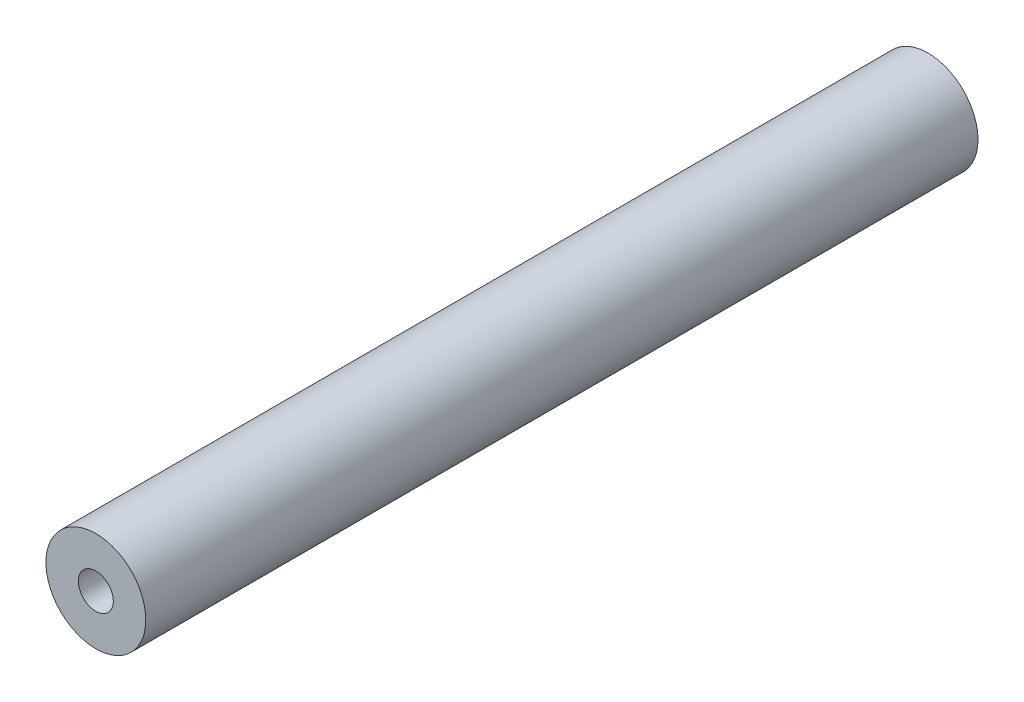
ISO-10303-21;
HEADER;
FILE_DESCRIPTION(('STEP AP214'),'2;1');
FILE_NAME('part.step','',(''),(''),'','','');
FILE_SCHEMA(('AUTOMOTIVE_DESIGN { 1 0 10303 214 1 1 1 1 }'));
ENDSEC;
DATA;
#1=APPLICATION_CONTEXT('core data for automotive mechanical design processes');
#2=APPLICATION_PROTOCOL_DEFINITION('international standard','automotive_design',2000,#1);
#3=PRODUCT_CONTEXT('',#1,'mechanical');
#4=PRODUCT('Part','Part','',(#3));
#5=PRODUCT_RELATED_PRODUCT_CATEGORY('part','',(#4));
#6=PRODUCT_DEFINITION_FORMATION('','',#4);
#7=PRODUCT_DEFINITION_CONTEXT('part definition',#1,'design');
#8=PRODUCT_DEFINITION('design','',#6,#7);
#9=PRODUCT_DEFINITION_SHAPE('','',#8);
#10=(LENGTH_UNIT() NAMED_UNIT(*) SI_UNIT(.MILLI.,.METRE.));
#11=(NAMED_UNIT(*) PLANE_ANGLE_UNIT() SI_UNIT($,.RADIAN.));
#12=(NAMED_UNIT(*) SI_UNIT($,.STERADIAN.) SOLID_ANGLE_UNIT());
#13=UNCERTAINTY_MEASURE_WITH_UNIT(LENGTH_MEASURE(1.E-05),#10,'distance_accuracy_value','');
#14=(GEOMETRIC_REPRESENTATION_CONTEXT(3) GLOBAL_UNCERTAINTY_ASSIGNED_CONTEXT((#13)) GLOBAL_UNIT_ASSIGNED_CONTEXT((#10,
#11,#12)) REPRESENTATION_CONTEXT('',''));
#15=CARTESIAN_POINT('',(0.,0.,0.));
#16=DIRECTION('',(0.,0.,1.));
#17=DIRECTION('',(1.,0.,0.));
#18=AXIS2_PLACEMENT_3D('',#15,#16,#17);
#19=CARTESIAN_POINT('',(62.9330708661417,-29.4903135174447,-66.9705627484771));
#20=DIRECTION('',(0.,0.,1.));
#21=DIRECTION('',(1.,0.,0.));
#22=AXIS2_PLACEMENT_3D('',#19,#20,#21);
#23=CYLINDRICAL_SURFACE('',#22,6.);
#24=CARTESIAN_POINT('',(62.9330708661417,-29.4903135174447,-50.));
#25=DIRECTION('',(0.,0.,1.));
#26=DIRECTION('',(1.,0.,0.));
#27=AXIS2_PLACEMENT_3D('',#24,#25,#26);
#28=CIRCLE('',#27,6.);
#29=CARTESIAN_POINT('',(68.9330708661417,-29.4903135174447,-50.));
#30=VERTEX_POINT('',#29);
#31=EDGE_CURVE('E11',#30,#30,#28,.F.);
#32=ORIENTED_EDGE('',*,*,#31,.F.);
#33=EDGE_LOOP('',(#32));
#34=FACE_BOUND('',#33,.T.);
#35=CARTESIAN_POINT('',(62.9330708661417,-29.4903135174447,50.));
#36=DIRECTION('',(0.,0.,1.));
#37=DIRECTION('',(1.,0.,0.));
#38=AXIS2_PLACEMENT_3D('',#35,#36,#37);
#39=CIRCLE('',#38,6.);
#40=CARTESIAN_POINT('',(68.9330708661417,-29.4903135174447,50.));
#41=VERTEX_POINT('',#40);
#42=EDGE_CURVE('E42',#41,#41,#39,.T.);
#43=ORIENTED_EDGE('',*,*,#42,.F.);
#44=EDGE_LOOP('',(#43));
#45=FACE_BOUND('',#44,.T.);
#46=ADVANCED_FACE('F35',(#34,#45),#23,.T.);
#47=CARTESIAN_POINT('',(0.,0.,-50.));
#48=DIRECTION('',(0.,0.,1.));
#49=DIRECTION('',(1.,0.,0.));
#50=AXIS2_PLACEMENT_3D('',#47,#48,#49);
#51=PLANE('',#50);
#52=CARTESIAN_POINT('',(62.9330708661417,-29.4903135174447,-50.));
#53=DIRECTION('',(0.,0.,-1.));
#54=DIRECTION('',(-1.,0.,0.));
#55=AXIS2_PLACEMENT_3D('',#52,#53,#54);
#56=CIRCLE('',#55,2.09999999999999);
#57=CARTESIAN_POINT('',(60.8330708661418,-29.4903135174447,-50.));
#58=VERTEX_POINT('',#57);
#59=EDGE_CURVE('E58',#58,#58,#56,.T.);
#60=ORIENTED_EDGE('',*,*,#59,.F.);
#61=EDGE_LOOP('',(#60));
#62=FACE_BOUND('',#61,.T.);
#63=ORIENTED_EDGE('',*,*,#31,.T.);
#64=EDGE_LOOP('',(#63));
#65=FACE_BOUND('',#64,.T.);
#66=ADVANCED_FACE('F74',(#62,#65),#51,.F.);
#67=CARTESIAN_POINT('',(0.,0.,50.));
#68=DIRECTION('',(0.,0.,1.));
#69=DIRECTION('',(1.,0.,0.));
#70=AXIS2_PLACEMENT_3D('',#67,#68,#69);
#71=PLANE('',#70);
#72=CARTESIAN_POINT('',(62.9330708661417,-29.4903135174447,50.));
#73=DIRECTION('',(0.,0.,1.));
#74=DIRECTION('',(1.,0.,0.));
#75=AXIS2_PLACEMENT_3D('',#72,#73,#74);
#76=CIRCLE('',#75,2.09999999999999);
#77=CARTESIAN_POINT('',(65.0330708661417,-29.4903135174447,50.));
#78=VERTEX_POINT('',#77);
#79=EDGE_CURVE('E59',#78,#78,#76,.T.);
#80=ORIENTED_EDGE('',*,*,#79,.F.);
#81=EDGE_LOOP('',(#80));
#82=FACE_BOUND('',#81,.T.);
#83=ORIENTED_EDGE('',*,*,#42,.T.);
#84=EDGE_LOOP('',(#83));
#85=FACE_BOUND('',#84,.T.);
#86=ADVANCED_FACE('F71',(#82,#85),#71,.T.);
#87=CARTESIAN_POINT('',(62.9330708661417,-29.4903135174447,-30.));
#88=DIRECTION('',(0.,0.,-1.));
#89=DIRECTION('',(-1.,0.,0.));
#90=AXIS2_PLACEMENT_3D('',#87,#88,#89);
#91=CONICAL_SURFACE('',#90,2.09999999999999,1.02974425867665);
#92=CARTESIAN_POINT('',(62.9330708661417,-29.4903135174447,-28.7381927000421));
#93=VERTEX_POINT('',#92);
#94=VERTEX_LOOP('',#93);
#95=FACE_BOUND('',#94,.T.);
#96=CARTESIAN_POINT('',(62.9330708661417,-29.4903135174447,-30.));
#97=DIRECTION('',(0.,0.,-1.));
#98=DIRECTION('',(-1.,0.,0.));
#99=AXIS2_PLACEMENT_3D('',#96,#97,#98);
#100=CIRCLE('',#99,2.09999999999999);
#101=CARTESIAN_POINT('',(60.8330708661418,-29.4903135174447,-30.));
#102=VERTEX_POINT('',#101);
#103=EDGE_CURVE('E62',#102,#102,#100,.T.);
#104=ORIENTED_EDGE('',*,*,#103,.T.);
#105=EDGE_LOOP('',(#104));
#106=FACE_BOUND('',#105,.T.);
#107=ADVANCED_FACE('F85',(#95,#106),#91,.F.);
#108=CARTESIAN_POINT('',(62.9330708661417,-29.4903135174447,-50.));
#109=DIRECTION('',(0.,0.,-1.));
#110=DIRECTION('',(-1.,0.,0.));
#111=AXIS2_PLACEMENT_3D('',#108,#109,#110);
#112=CYLINDRICAL_SURFACE('',#111,2.09999999999999);
#113=ORIENTED_EDGE('',*,*,#103,.F.);
#114=EDGE_LOOP('',(#113));
#115=FACE_BOUND('',#114,.T.);
#116=ORIENTED_EDGE('',*,*,#59,.T.);
#117=EDGE_LOOP('',(#116));
#118=FACE_BOUND('',#117,.T.);
#119=ADVANCED_FACE('F52',(#115,#118),#112,.F.);
#120=CARTESIAN_POINT('',(62.9330708661417,-29.4903135174447,30.));
#121=DIRECTION('',(0.,0.,1.));
#122=DIRECTION('',(1.,0.,0.));
#123=AXIS2_PLACEMENT_3D('',#120,#121,#122);
#124=CONICAL_SURFACE('',#123,2.09999999999999,1.02974425867665);
#125=CARTESIAN_POINT('',(62.9330708661417,-29.4903135174447,28.7381927000421));
#126=VERTEX_POINT('',#125);
#127=VERTEX_LOOP('',#126);
#128=FACE_BOUND('',#127,.T.);
#129=CARTESIAN_POINT('',(62.9330708661417,-29.4903135174447,30.));
#130=DIRECTION('',(0.,0.,1.));
#131=DIRECTION('',(1.,0.,0.));
#132=AXIS2_PLACEMENT_3D('',#129,#130,#131);
#133=CIRCLE('',#132,2.09999999999999);
#134=CARTESIAN_POINT('',(65.0330708661417,-29.4903135174447,30.));
#135=VERTEX_POINT('',#134);
#136=EDGE_CURVE('E56',#135,#135,#133,.T.);
#137=ORIENTED_EDGE('',*,*,#136,.T.);
#138=EDGE_LOOP('',(#137));
#139=FACE_BOUND('',#138,.T.);
#140=ADVANCED_FACE('F48',(#128,#139),#124,.F.);
#141=CARTESIAN_POINT('',(62.9330708661417,-29.4903135174447,50.));
#142=DIRECTION('',(0.,0.,1.));
#143=DIRECTION('',(1.,0.,0.));
#144=AXIS2_PLACEMENT_3D('',#141,#142,#143);
#145=CYLINDRICAL_SURFACE('',#144,2.09999999999999);
#146=ORIENTED_EDGE('',*,*,#136,.F.);
#147=EDGE_LOOP('',(#146));
#148=FACE_BOUND('',#147,.T.);
#149=ORIENTED_EDGE('',*,*,#79,.T.);
#150=EDGE_LOOP('',(#149));
#151=FACE_BOUND('',#150,.T.);
#152=ADVANCED_FACE('F51',(#148,#151),#145,.F.);
#153=CLOSED_SHELL('',(#46,#66,#86,#107,#119,#140,#152));
#154=MANIFOLD_SOLID_BREP('B2',#153);
#155=ADVANCED_BREP_SHAPE_REPRESENTATION('',(#18,#154),#14);
#156=SHAPE_DEFINITION_REPRESENTATION(#9,#155);
ENDSEC;
END-ISO-10303-21;
